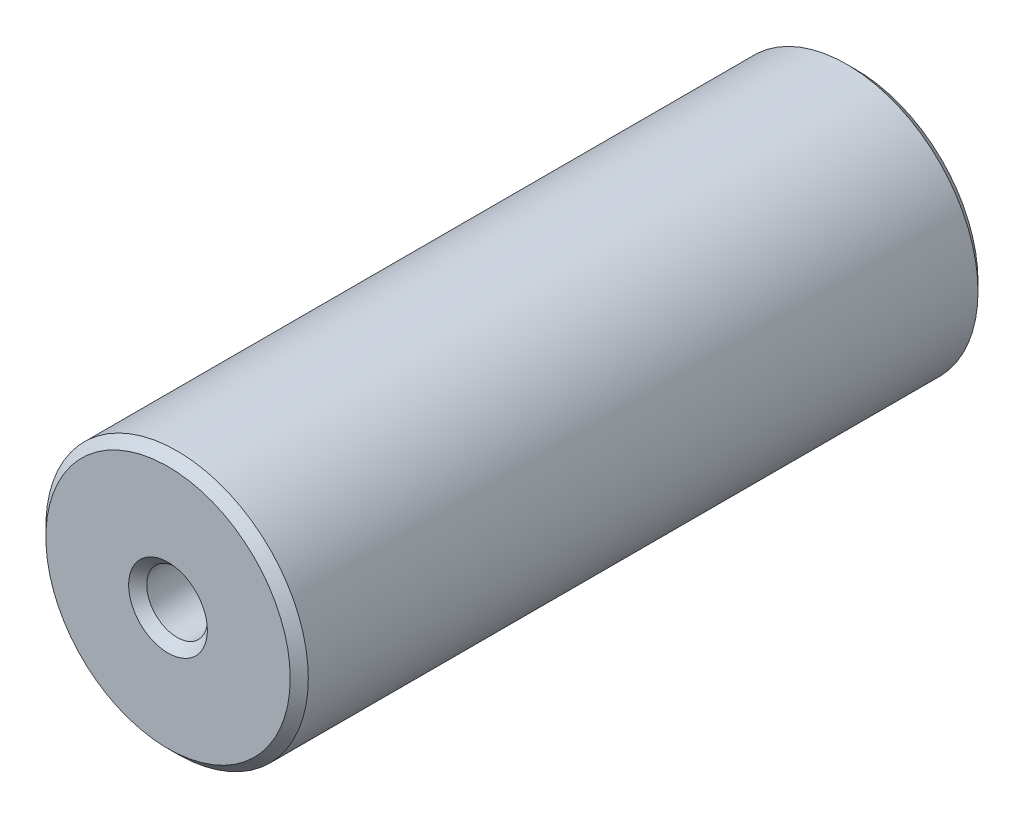
ISO-10303-21;
HEADER;
FILE_DESCRIPTION(('STEP AP214'),'2;1');
FILE_NAME('part.step','',(''),(''),'','','');
FILE_SCHEMA(('AUTOMOTIVE_DESIGN { 1 0 10303 214 1 1 1 1 }'));
ENDSEC;
DATA;
#1=APPLICATION_CONTEXT('core data for automotive mechanical design processes');
#2=APPLICATION_PROTOCOL_DEFINITION('international standard','automotive_design',2000,#1);
#3=PRODUCT_CONTEXT('',#1,'mechanical');
#4=PRODUCT('Part','Part','',(#3));
#5=PRODUCT_RELATED_PRODUCT_CATEGORY('part','',(#4));
#6=PRODUCT_DEFINITION_FORMATION('','',#4);
#7=PRODUCT_DEFINITION_CONTEXT('part definition',#1,'design');
#8=PRODUCT_DEFINITION('design','',#6,#7);
#9=PRODUCT_DEFINITION_SHAPE('','',#8);
#10=(LENGTH_UNIT() NAMED_UNIT(*) SI_UNIT(.MILLI.,.METRE.));
#11=(NAMED_UNIT(*) PLANE_ANGLE_UNIT() SI_UNIT($,.RADIAN.));
#12=(NAMED_UNIT(*) SI_UNIT($,.STERADIAN.) SOLID_ANGLE_UNIT());
#13=UNCERTAINTY_MEASURE_WITH_UNIT(LENGTH_MEASURE(1.E-05),#10,'distance_accuracy_value','');
#14=(GEOMETRIC_REPRESENTATION_CONTEXT(3) GLOBAL_UNCERTAINTY_ASSIGNED_CONTEXT((#13)) GLOBAL_UNIT_ASSIGNED_CONTEXT((#10,
#11,#12)) REPRESENTATION_CONTEXT('',''));
#15=CARTESIAN_POINT('',(0.,0.,0.));
#16=DIRECTION('',(0.,0.,1.));
#17=DIRECTION('',(1.,0.,0.));
#18=AXIS2_PLACEMENT_3D('',#15,#16,#17);
#19=CARTESIAN_POINT('',(0.,0.,76.));
#20=DIRECTION('',(0.,0.,1.));
#21=DIRECTION('',(1.,0.,0.));
#22=AXIS2_PLACEMENT_3D('',#19,#20,#21);
#23=PLANE('',#22);
#24=CARTESIAN_POINT('',(0.,0.,76.));
#25=DIRECTION('',(0.,0.,1.));
#26=DIRECTION('',(1.,0.,0.));
#27=AXIS2_PLACEMENT_3D('',#24,#25,#26);
#28=CIRCLE('',#27,4.34999999999999);
#29=CARTESIAN_POINT('',(4.34999999999999,0.,76.));
#30=VERTEX_POINT('',#29);
#31=EDGE_CURVE('E41',#30,#30,#28,.F.);
#32=ORIENTED_EDGE('',*,*,#31,.T.);
#33=EDGE_LOOP('',(#32));
#34=FACE_BOUND('',#33,.T.);
#35=CARTESIAN_POINT('',(0.,0.,76.));
#36=DIRECTION('',(0.,0.,1.));
#37=DIRECTION('',(1.,0.,0.));
#38=AXIS2_PLACEMENT_3D('',#35,#36,#37);
#39=CIRCLE('',#38,13.5);
#40=CARTESIAN_POINT('',(13.5,0.,76.));
#41=VERTEX_POINT('',#40);
#42=EDGE_CURVE('E45',#41,#41,#39,.T.);
#43=ORIENTED_EDGE('',*,*,#42,.T.);
#44=EDGE_LOOP('',(#43));
#45=FACE_BOUND('',#44,.T.);
#46=ADVANCED_FACE('F30',(#34,#45),#23,.T.);
#47=CARTESIAN_POINT('',(0.,0.,0.));
#48=DIRECTION('',(0.,0.,1.));
#49=DIRECTION('',(1.,0.,0.));
#50=AXIS2_PLACEMENT_3D('',#47,#48,#49);
#51=PLANE('',#50);
#52=CARTESIAN_POINT('',(0.,0.,0.));
#53=DIRECTION('',(0.,0.,1.));
#54=DIRECTION('',(1.,0.,0.));
#55=AXIS2_PLACEMENT_3D('',#52,#53,#54);
#56=CIRCLE('',#55,4.35000000000001);
#57=CARTESIAN_POINT('',(4.35000000000001,0.,0.));
#58=VERTEX_POINT('',#57);
#59=EDGE_CURVE('E56',#58,#58,#56,.T.);
#60=ORIENTED_EDGE('',*,*,#59,.T.);
#61=EDGE_LOOP('',(#60));
#62=FACE_BOUND('',#61,.T.);
#63=CARTESIAN_POINT('',(0.,0.,0.));
#64=DIRECTION('',(0.,0.,1.));
#65=DIRECTION('',(1.,0.,0.));
#66=AXIS2_PLACEMENT_3D('',#63,#64,#65);
#67=CIRCLE('',#66,13.5);
#68=CARTESIAN_POINT('',(13.5,0.,0.));
#69=VERTEX_POINT('',#68);
#70=EDGE_CURVE('E59',#69,#69,#67,.F.);
#71=ORIENTED_EDGE('',*,*,#70,.T.);
#72=EDGE_LOOP('',(#71));
#73=FACE_BOUND('',#72,.T.);
#74=ADVANCED_FACE('F63',(#62,#73),#51,.F.);
#75=CARTESIAN_POINT('',(0.,0.,76.));
#76=DIRECTION('',(0.,0.,-1.));
#77=DIRECTION('',(-1.,0.,0.));
#78=AXIS2_PLACEMENT_3D('',#75,#76,#77);
#79=CYLINDRICAL_SURFACE('',#78,14.5);
#80=CARTESIAN_POINT('',(0.,0.,1.00000000000003));
#81=DIRECTION('',(0.,0.,1.));
#82=DIRECTION('',(1.,0.,0.));
#83=AXIS2_PLACEMENT_3D('',#80,#81,#82);
#84=CIRCLE('',#83,14.5);
#85=CARTESIAN_POINT('',(14.5,0.,1.00000000000003));
#86=VERTEX_POINT('',#85);
#87=EDGE_CURVE('E10',#86,#86,#84,.T.);
#88=ORIENTED_EDGE('',*,*,#87,.T.);
#89=EDGE_LOOP('',(#88));
#90=FACE_BOUND('',#89,.T.);
#91=CARTESIAN_POINT('',(0.,0.,75.));
#92=DIRECTION('',(0.,0.,1.));
#93=DIRECTION('',(1.,0.,0.));
#94=AXIS2_PLACEMENT_3D('',#91,#92,#93);
#95=CIRCLE('',#94,14.5);
#96=CARTESIAN_POINT('',(14.5,0.,75.));
#97=VERTEX_POINT('',#96);
#98=EDGE_CURVE('E37',#97,#97,#95,.F.);
#99=ORIENTED_EDGE('',*,*,#98,.T.);
#100=EDGE_LOOP('',(#99));
#101=FACE_BOUND('',#100,.T.);
#102=ADVANCED_FACE('F83',(#90,#101),#79,.T.);
#103=CARTESIAN_POINT('',(0.,0.,76.));
#104=DIRECTION('',(0.,0.,-1.));
#105=DIRECTION('',(-1.,0.,0.));
#106=AXIS2_PLACEMENT_3D('',#103,#104,#105);
#107=CYLINDRICAL_SURFACE('',#106,3.35);
#108=CARTESIAN_POINT('',(0.,0.,1.00000000000001));
#109=DIRECTION('',(0.,0.,1.));
#110=DIRECTION('',(1.,0.,0.));
#111=AXIS2_PLACEMENT_3D('',#108,#109,#110);
#112=CIRCLE('',#111,3.35);
#113=CARTESIAN_POINT('',(3.35,0.,1.00000000000001));
#114=VERTEX_POINT('',#113);
#115=EDGE_CURVE('E50',#114,#114,#112,.F.);
#116=ORIENTED_EDGE('',*,*,#115,.T.);
#117=EDGE_LOOP('',(#116));
#118=FACE_BOUND('',#117,.T.);
#119=CARTESIAN_POINT('',(0.,0.,75.));
#120=DIRECTION('',(0.,0.,1.));
#121=DIRECTION('',(1.,0.,0.));
#122=AXIS2_PLACEMENT_3D('',#119,#120,#121);
#123=CIRCLE('',#122,3.35);
#124=CARTESIAN_POINT('',(3.35,0.,75.));
#125=VERTEX_POINT('',#124);
#126=EDGE_CURVE('E53',#125,#125,#123,.T.);
#127=ORIENTED_EDGE('',*,*,#126,.T.);
#128=EDGE_LOOP('',(#127));
#129=FACE_BOUND('',#128,.T.);
#130=ADVANCED_FACE('F88',(#118,#129),#107,.F.);
#131=CARTESIAN_POINT('',(0.,0.,0.));
#132=DIRECTION('',(0.,0.,-1.));
#133=DIRECTION('',(-1.,0.,0.));
#134=AXIS2_PLACEMENT_3D('',#131,#132,#133);
#135=CONICAL_SURFACE('',#134,4.35000000000001,0.785398163397444);
#136=ORIENTED_EDGE('',*,*,#115,.F.);
#137=EDGE_LOOP('',(#136));
#138=FACE_BOUND('',#137,.T.);
#139=ORIENTED_EDGE('',*,*,#59,.F.);
#140=EDGE_LOOP('',(#139));
#141=FACE_BOUND('',#140,.T.);
#142=ADVANCED_FACE('F74',(#138,#141),#135,.F.);
#143=CARTESIAN_POINT('',(0.,0.,75.));
#144=DIRECTION('',(0.,0.,1.));
#145=DIRECTION('',(1.,0.,0.));
#146=AXIS2_PLACEMENT_3D('',#143,#144,#145);
#147=CONICAL_SURFACE('',#146,3.35,0.785398163397444);
#148=ORIENTED_EDGE('',*,*,#31,.F.);
#149=EDGE_LOOP('',(#148));
#150=FACE_BOUND('',#149,.T.);
#151=ORIENTED_EDGE('',*,*,#126,.F.);
#152=EDGE_LOOP('',(#151));
#153=FACE_BOUND('',#152,.T.);
#154=ADVANCED_FACE('F68',(#150,#153),#147,.F.);
#155=CARTESIAN_POINT('',(0.,0.,1.00000000000003));
#156=DIRECTION('',(0.,0.,1.));
#157=DIRECTION('',(1.,0.,0.));
#158=AXIS2_PLACEMENT_3D('',#155,#156,#157);
#159=CONICAL_SURFACE('',#158,14.5,0.785398163397454);
#160=ORIENTED_EDGE('',*,*,#70,.F.);
#161=EDGE_LOOP('',(#160));
#162=FACE_BOUND('',#161,.T.);
#163=ORIENTED_EDGE('',*,*,#87,.F.);
#164=EDGE_LOOP('',(#163));
#165=FACE_BOUND('',#164,.T.);
#166=ADVANCED_FACE('F65',(#162,#165),#159,.T.);
#167=CARTESIAN_POINT('',(0.,0.,76.));
#168=DIRECTION('',(0.,0.,-1.));
#169=DIRECTION('',(-1.,0.,0.));
#170=AXIS2_PLACEMENT_3D('',#167,#168,#169);
#171=CONICAL_SURFACE('',#170,13.5,0.785398163397432);
#172=ORIENTED_EDGE('',*,*,#98,.F.);
#173=EDGE_LOOP('',(#172));
#174=FACE_BOUND('',#173,.T.);
#175=ORIENTED_EDGE('',*,*,#42,.F.);
#176=EDGE_LOOP('',(#175));
#177=FACE_BOUND('',#176,.T.);
#178=ADVANCED_FACE('F32',(#174,#177),#171,.T.);
#179=CLOSED_SHELL('',(#46,#74,#102,#130,#142,#154,#166,#178));
#180=MANIFOLD_SOLID_BREP('B2',#179);
#181=ADVANCED_BREP_SHAPE_REPRESENTATION('',(#18,#180),#14);
#182=SHAPE_DEFINITION_REPRESENTATION(#9,#181);
ENDSEC;
END-ISO-10303-21;
